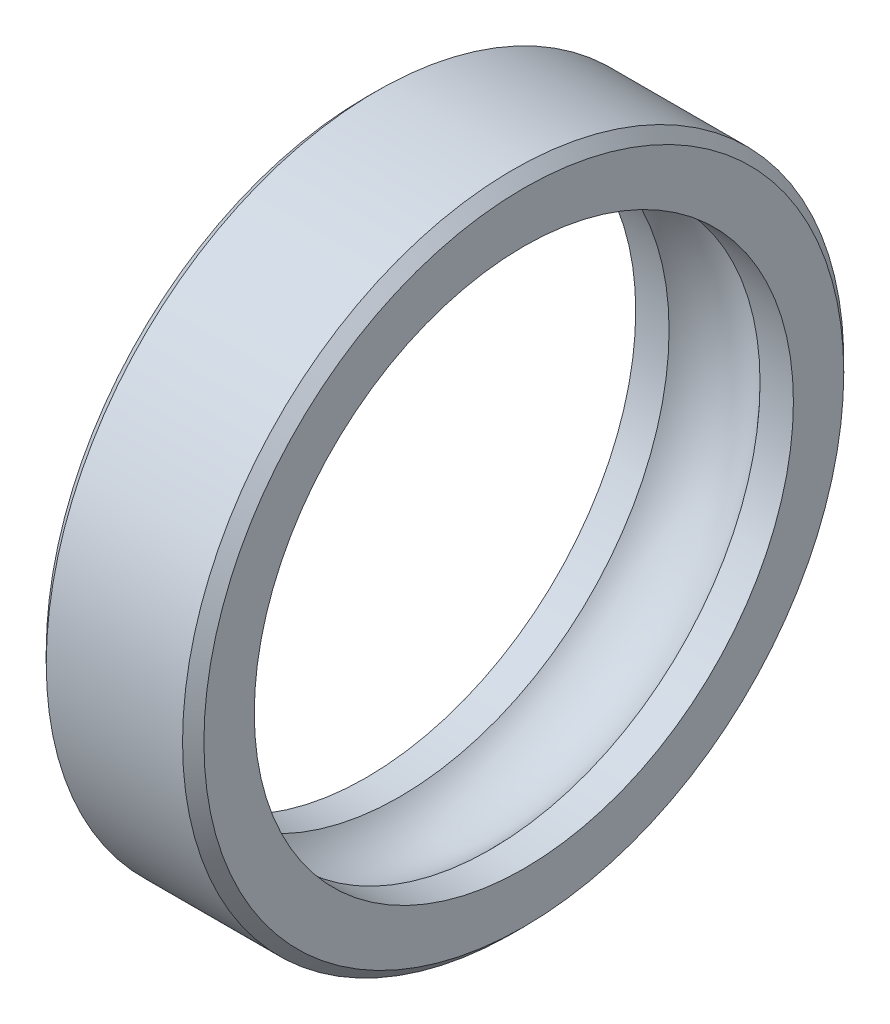
ISO-10303-21;
HEADER;
FILE_DESCRIPTION(('STEP AP214'),'2;1');
FILE_NAME('part.step','',(''),(''),'','','');
FILE_SCHEMA(('AUTOMOTIVE_DESIGN { 1 0 10303 214 1 1 1 1 }'));
ENDSEC;
DATA;
#1=APPLICATION_CONTEXT('core data for automotive mechanical design processes');
#2=APPLICATION_PROTOCOL_DEFINITION('international standard','automotive_design',2000,#1);
#3=PRODUCT_CONTEXT('',#1,'mechanical');
#4=PRODUCT('Part','Part','',(#3));
#5=PRODUCT_RELATED_PRODUCT_CATEGORY('part','',(#4));
#6=PRODUCT_DEFINITION_FORMATION('','',#4);
#7=PRODUCT_DEFINITION_CONTEXT('part definition',#1,'design');
#8=PRODUCT_DEFINITION('design','',#6,#7);
#9=PRODUCT_DEFINITION_SHAPE('','',#8);
#10=(LENGTH_UNIT() NAMED_UNIT(*) SI_UNIT(.MILLI.,.METRE.));
#11=(NAMED_UNIT(*) PLANE_ANGLE_UNIT() SI_UNIT($,.RADIAN.));
#12=(NAMED_UNIT(*) SI_UNIT($,.STERADIAN.) SOLID_ANGLE_UNIT());
#13=UNCERTAINTY_MEASURE_WITH_UNIT(LENGTH_MEASURE(1.E-05),#10,'distance_accuracy_value','');
#14=(GEOMETRIC_REPRESENTATION_CONTEXT(3) GLOBAL_UNCERTAINTY_ASSIGNED_CONTEXT((#13)) GLOBAL_UNIT_ASSIGNED_CONTEXT((#10,
#11,#12)) REPRESENTATION_CONTEXT('',''));
#15=CARTESIAN_POINT('',(0.,0.,0.));
#16=DIRECTION('',(0.,0.,1.));
#17=DIRECTION('',(1.,0.,0.));
#18=AXIS2_PLACEMENT_3D('',#15,#16,#17);
#19=CARTESIAN_POINT('',(-15.5,53.,0.));
#20=DIRECTION('',(1.,0.,0.));
#21=DIRECTION('',(0.,0.,-1.));
#22=AXIS2_PLACEMENT_3D('',#19,#20,#21);
#23=PLANE('',#22);
#24=CARTESIAN_POINT('',(-15.5,0.,0.));
#25=DIRECTION('',(1.,0.,0.));
#26=DIRECTION('',(0.,0.,-1.));
#27=AXIS2_PLACEMENT_3D('',#24,#25,#26);
#28=CIRCLE('',#27,62.9);
#29=CARTESIAN_POINT('',(-15.5,0.,-62.9));
#30=VERTEX_POINT('',#29);
#31=EDGE_CURVE('E10',#30,#30,#28,.F.);
#32=ORIENTED_EDGE('',*,*,#31,.T.);
#33=EDGE_LOOP('',(#32));
#34=FACE_BOUND('',#33,.T.);
#35=CARTESIAN_POINT('',(-15.5,0.,0.));
#36=DIRECTION('',(-1.,0.,0.));
#37=DIRECTION('',(0.,0.,1.));
#38=AXIS2_PLACEMENT_3D('',#35,#36,#37);
#39=CIRCLE('',#38,53.);
#40=CARTESIAN_POINT('',(-15.5,0.,53.));
#41=VERTEX_POINT('',#40);
#42=EDGE_CURVE('E73',#41,#41,#39,.T.);
#43=ORIENTED_EDGE('',*,*,#42,.F.);
#44=EDGE_LOOP('',(#43));
#45=FACE_BOUND('',#44,.T.);
#46=ADVANCED_FACE('F37',(#34,#45),#23,.F.);
#47=CARTESIAN_POINT('',(-15.9982142857143,0.,0.));
#48=DIRECTION('',(-1.,0.,0.));
#49=DIRECTION('',(0.,0.,1.));
#50=AXIS2_PLACEMENT_3D('',#47,#48,#49);
#51=CYLINDRICAL_SURFACE('',#50,65.);
#52=CARTESIAN_POINT('',(13.4,0.,0.));
#53=DIRECTION('',(-1.,0.,0.));
#54=DIRECTION('',(0.,0.,1.));
#55=AXIS2_PLACEMENT_3D('',#52,#53,#54);
#56=CIRCLE('',#55,65.);
#57=CARTESIAN_POINT('',(13.4,0.,65.));
#58=VERTEX_POINT('',#57);
#59=EDGE_CURVE('E50',#58,#58,#56,.T.);
#60=ORIENTED_EDGE('',*,*,#59,.T.);
#61=EDGE_LOOP('',(#60));
#62=FACE_BOUND('',#61,.T.);
#63=CARTESIAN_POINT('',(-13.4,0.,0.));
#64=DIRECTION('',(1.,0.,0.));
#65=DIRECTION('',(0.,0.,-1.));
#66=AXIS2_PLACEMENT_3D('',#63,#64,#65);
#67=CIRCLE('',#66,65.);
#68=CARTESIAN_POINT('',(-13.4,0.,-65.));
#69=VERTEX_POINT('',#68);
#70=EDGE_CURVE('E55',#69,#69,#67,.T.);
#71=ORIENTED_EDGE('',*,*,#70,.T.);
#72=EDGE_LOOP('',(#71));
#73=FACE_BOUND('',#72,.T.);
#74=ADVANCED_FACE('F81',(#62,#73),#51,.T.);
#75=CARTESIAN_POINT('',(15.5,53.,0.));
#76=DIRECTION('',(-1.,0.,0.));
#77=DIRECTION('',(0.,0.,1.));
#78=AXIS2_PLACEMENT_3D('',#75,#76,#77);
#79=PLANE('',#78);
#80=CARTESIAN_POINT('',(15.5,0.,0.));
#81=DIRECTION('',(-1.,0.,0.));
#82=DIRECTION('',(0.,0.,1.));
#83=AXIS2_PLACEMENT_3D('',#80,#81,#82);
#84=CIRCLE('',#83,62.8999999999999);
#85=CARTESIAN_POINT('',(15.5,0.,62.8999999999999));
#86=VERTEX_POINT('',#85);
#87=EDGE_CURVE('E45',#86,#86,#84,.F.);
#88=ORIENTED_EDGE('',*,*,#87,.T.);
#89=EDGE_LOOP('',(#88));
#90=FACE_BOUND('',#89,.T.);
#91=CARTESIAN_POINT('',(15.5,0.,0.));
#92=DIRECTION('',(-1.,0.,0.));
#93=DIRECTION('',(0.,0.,1.));
#94=AXIS2_PLACEMENT_3D('',#91,#92,#93);
#95=CIRCLE('',#94,53.);
#96=CARTESIAN_POINT('',(15.5,0.,53.));
#97=VERTEX_POINT('',#96);
#98=EDGE_CURVE('E61',#97,#97,#95,.T.);
#99=ORIENTED_EDGE('',*,*,#98,.T.);
#100=EDGE_LOOP('',(#99));
#101=FACE_BOUND('',#100,.T.);
#102=ADVANCED_FACE('F86',(#90,#101),#79,.F.);
#103=CARTESIAN_POINT('',(-15.9982142857143,0.,0.));
#104=DIRECTION('',(-1.,0.,0.));
#105=DIRECTION('',(0.,0.,1.));
#106=AXIS2_PLACEMENT_3D('',#103,#104,#105);
#107=CYLINDRICAL_SURFACE('',#106,53.);
#108=ORIENTED_EDGE('',*,*,#98,.F.);
#109=EDGE_LOOP('',(#108));
#110=FACE_BOUND('',#109,.T.);
#111=CARTESIAN_POINT('',(8.94427190999917,0.,0.));
#112=DIRECTION('',(-1.,0.,0.));
#113=DIRECTION('',(0.,0.,1.));
#114=AXIS2_PLACEMENT_3D('',#111,#112,#113);
#115=CIRCLE('',#114,53.);
#116=CARTESIAN_POINT('',(8.94427190999917,0.,53.));
#117=VERTEX_POINT('',#116);
#118=EDGE_CURVE('E65',#117,#117,#115,.T.);
#119=ORIENTED_EDGE('',*,*,#118,.T.);
#120=EDGE_LOOP('',(#119));
#121=FACE_BOUND('',#120,.T.);
#122=ADVANCED_FACE('F109',(#110,#121),#107,.F.);
#123=CARTESIAN_POINT('',(0.,0.,0.));
#124=DIRECTION('',(-1.,0.,0.));
#125=DIRECTION('',(0.,0.,1.));
#126=AXIS2_PLACEMENT_3D('',#123,#124,#125);
#127=TOROIDAL_SURFACE('',#126,45.,12.);
#128=ORIENTED_EDGE('',*,*,#118,.F.);
#129=EDGE_LOOP('',(#128));
#130=FACE_BOUND('',#129,.T.);
#131=CARTESIAN_POINT('',(-8.94427190999916,0.,0.));
#132=DIRECTION('',(-1.,0.,0.));
#133=DIRECTION('',(0.,0.,1.));
#134=AXIS2_PLACEMENT_3D('',#131,#132,#133);
#135=CIRCLE('',#134,53.);
#136=CARTESIAN_POINT('',(-8.94427190999916,0.,53.));
#137=VERTEX_POINT('',#136);
#138=EDGE_CURVE('E69',#137,#137,#135,.T.);
#139=ORIENTED_EDGE('',*,*,#138,.T.);
#140=EDGE_LOOP('',(#139));
#141=FACE_BOUND('',#140,.T.);
#142=ADVANCED_FACE('F98',(#130,#141),#127,.F.);
#143=CARTESIAN_POINT('',(-15.9982142857143,0.,0.));
#144=DIRECTION('',(-1.,0.,0.));
#145=DIRECTION('',(0.,0.,1.));
#146=AXIS2_PLACEMENT_3D('',#143,#144,#145);
#147=CYLINDRICAL_SURFACE('',#146,53.);
#148=ORIENTED_EDGE('',*,*,#138,.F.);
#149=EDGE_LOOP('',(#148));
#150=FACE_BOUND('',#149,.T.);
#151=ORIENTED_EDGE('',*,*,#42,.T.);
#152=EDGE_LOOP('',(#151));
#153=FACE_BOUND('',#152,.T.);
#154=ADVANCED_FACE('F78',(#150,#153),#147,.F.);
#155=CARTESIAN_POINT('',(13.4,0.,0.));
#156=DIRECTION('',(-1.,0.,0.));
#157=DIRECTION('',(0.,0.,1.));
#158=AXIS2_PLACEMENT_3D('',#155,#156,#157);
#159=CONICAL_SURFACE('',#158,65.,0.785398163397452);
#160=ORIENTED_EDGE('',*,*,#87,.F.);
#161=EDGE_LOOP('',(#160));
#162=FACE_BOUND('',#161,.T.);
#163=ORIENTED_EDGE('',*,*,#59,.F.);
#164=EDGE_LOOP('',(#163));
#165=FACE_BOUND('',#164,.T.);
#166=ADVANCED_FACE('F90',(#162,#165),#159,.T.);
#167=CARTESIAN_POINT('',(-15.5,0.,0.));
#168=DIRECTION('',(1.,0.,0.));
#169=DIRECTION('',(0.,0.,-1.));
#170=AXIS2_PLACEMENT_3D('',#167,#168,#169);
#171=CONICAL_SURFACE('',#170,62.9,0.785398163397445);
#172=ORIENTED_EDGE('',*,*,#70,.F.);
#173=EDGE_LOOP('',(#172));
#174=FACE_BOUND('',#173,.T.);
#175=ORIENTED_EDGE('',*,*,#31,.F.);
#176=EDGE_LOOP('',(#175));
#177=FACE_BOUND('',#176,.T.);
#178=ADVANCED_FACE('F39',(#174,#177),#171,.T.);
#179=CLOSED_SHELL('',(#46,#74,#102,#122,#142,#154,#166,#178));
#180=MANIFOLD_SOLID_BREP('B2',#179);
#181=ADVANCED_BREP_SHAPE_REPRESENTATION('',(#18,#180),#14);
#182=SHAPE_DEFINITION_REPRESENTATION(#9,#181);
ENDSEC;
END-ISO-10303-21;
